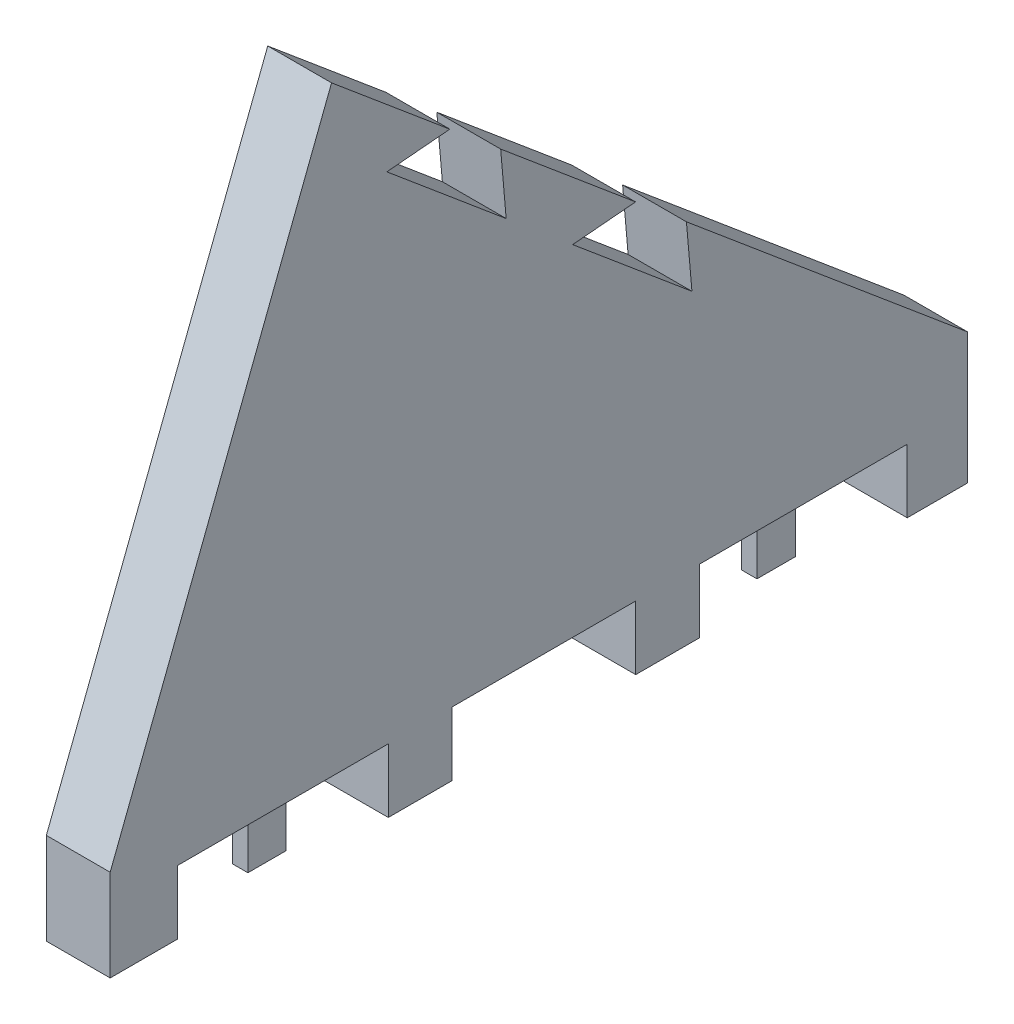
ISO-10303-21;
HEADER;
FILE_DESCRIPTION(('STEP AP214'),'2;1');
FILE_NAME('part.step','',(''),(''),'','','');
FILE_SCHEMA(('AUTOMOTIVE_DESIGN { 1 0 10303 214 1 1 1 1 }'));
ENDSEC;
DATA;
#1=APPLICATION_CONTEXT('core data for automotive mechanical design processes');
#2=APPLICATION_PROTOCOL_DEFINITION('international standard','automotive_design',2000,#1);
#3=PRODUCT_CONTEXT('',#1,'mechanical');
#4=PRODUCT('Part','Part','',(#3));
#5=PRODUCT_RELATED_PRODUCT_CATEGORY('part','',(#4));
#6=PRODUCT_DEFINITION_FORMATION('','',#4);
#7=PRODUCT_DEFINITION_CONTEXT('part definition',#1,'design');
#8=PRODUCT_DEFINITION('design','',#6,#7);
#9=PRODUCT_DEFINITION_SHAPE('','',#8);
#10=(LENGTH_UNIT() NAMED_UNIT(*) SI_UNIT(.MILLI.,.METRE.));
#11=(NAMED_UNIT(*) PLANE_ANGLE_UNIT() SI_UNIT($,.RADIAN.));
#12=(NAMED_UNIT(*) SI_UNIT($,.STERADIAN.) SOLID_ANGLE_UNIT());
#13=UNCERTAINTY_MEASURE_WITH_UNIT(LENGTH_MEASURE(1.E-05),#10,'distance_accuracy_value','');
#14=(GEOMETRIC_REPRESENTATION_CONTEXT(3) GLOBAL_UNCERTAINTY_ASSIGNED_CONTEXT((#13)) GLOBAL_UNIT_ASSIGNED_CONTEXT((#10,
#11,#12)) REPRESENTATION_CONTEXT('',''));
#15=CARTESIAN_POINT('',(0.,0.,0.));
#16=DIRECTION('',(0.,0.,1.));
#17=DIRECTION('',(1.,0.,0.));
#18=AXIS2_PLACEMENT_3D('',#15,#16,#17);
#19=CARTESIAN_POINT('',(5.,4.99883863747726,0.));
#20=DIRECTION('',(0.,1.,0.));
#21=DIRECTION('',(0.,0.,1.));
#22=AXIS2_PLACEMENT_3D('',#19,#20,#21);
#23=PLANE('',#22);
#24=DIRECTION('',(-1.,0.,0.));
#25=VECTOR('',#24,1.);
#26=CARTESIAN_POINT('',(3.25,4.99883863747764,-18.442857145));
#27=LINE('',#26,#25);
#28=CARTESIAN_POINT('',(3.25,4.99883863747751,-18.442857145));
#29=VERTEX_POINT('',#28);
#30=CARTESIAN_POINT('',(2.05,4.99883863747751,-18.442857145));
#31=VERTEX_POINT('',#30);
#32=EDGE_CURVE('E62',#29,#31,#27,.T.);
#33=ORIENTED_EDGE('',*,*,#32,.F.);
#34=DIRECTION('',(0.,0.,-1.));
#35=VECTOR('',#34,1.);
#36=CARTESIAN_POINT('',(3.25,4.99883863747764,0.));
#37=LINE('',#36,#35);
#38=CARTESIAN_POINT('',(3.25,4.99883863747755,-21.442857145));
#39=VERTEX_POINT('',#38);
#40=EDGE_CURVE('E304',#29,#39,#37,.T.);
#41=ORIENTED_EDGE('',*,*,#40,.T.);
#42=DIRECTION('',(-1.,0.,0.));
#43=VECTOR('',#42,1.);
#44=CARTESIAN_POINT('',(3.25,4.99883863747764,-21.442857145));
#45=LINE('',#44,#43);
#46=CARTESIAN_POINT('',(2.05,4.99883863747764,-21.442857145));
#47=VERTEX_POINT('',#46);
#48=EDGE_CURVE('E316',#39,#47,#45,.T.);
#49=ORIENTED_EDGE('',*,*,#48,.T.);
#50=DIRECTION('',(0.,0.,-1.));
#51=VECTOR('',#50,1.);
#52=CARTESIAN_POINT('',(2.05,4.99883863747764,0.));
#53=LINE('',#52,#51);
#54=EDGE_CURVE('E299',#31,#47,#53,.T.);
#55=ORIENTED_EDGE('',*,*,#54,.F.);
#56=EDGE_LOOP('',(#33,#41,#49,#55));
#57=FACE_BOUND('',#56,.T.);
#58=DIRECTION('',(0.,0.,-1.));
#59=VECTOR('',#58,1.);
#60=CARTESIAN_POINT('',(0.,4.99883863747726,0.));
#61=LINE('',#60,#59);
#62=CARTESIAN_POINT('',(0.,4.99883863747765,-12.192857145));
#63=VERTEX_POINT('',#62);
#64=CARTESIAN_POINT('',(0.,4.99883863747765,-28.4653269855797));
#65=VERTEX_POINT('',#64);
#66=EDGE_CURVE('E323',#63,#65,#61,.T.);
#67=ORIENTED_EDGE('',*,*,#66,.T.);
#68=DIRECTION('',(-1.,0.,0.));
#69=VECTOR('',#68,1.);
#70=CARTESIAN_POINT('',(5.,4.99883863747765,-28.4653269855797));
#71=LINE('',#70,#69);
#72=CARTESIAN_POINT('',(5.,4.99883863747765,-28.4653269855797));
#73=VERTEX_POINT('',#72);
#74=EDGE_CURVE('E11',#73,#65,#71,.T.);
#75=ORIENTED_EDGE('',*,*,#74,.F.);
#76=DIRECTION('',(0.,0.,-1.));
#77=VECTOR('',#76,1.);
#78=CARTESIAN_POINT('',(5.,4.99883863747726,0.));
#79=LINE('',#78,#77);
#80=CARTESIAN_POINT('',(5.,4.99883863747765,-12.192857145));
#81=VERTEX_POINT('',#80);
#82=EDGE_CURVE('E324',#81,#73,#79,.T.);
#83=ORIENTED_EDGE('',*,*,#82,.F.);
#84=DIRECTION('',(-1.,0.,0.));
#85=VECTOR('',#84,1.);
#86=CARTESIAN_POINT('',(5.,4.99883863747765,-12.192857145));
#87=LINE('',#86,#85);
#88=EDGE_CURVE('E387',#81,#63,#87,.T.);
#89=ORIENTED_EDGE('',*,*,#88,.T.);
#90=EDGE_LOOP('',(#67,#75,#83,#89));
#91=FACE_BOUND('',#90,.T.);
#92=ADVANCED_FACE('F40',(#57,#91),#23,.F.);
#93=CARTESIAN_POINT('',(5.,0.,-28.4653269855797));
#94=DIRECTION('',(0.,0.,-1.));
#95=DIRECTION('',(-1.,0.,0.));
#96=AXIS2_PLACEMENT_3D('',#93,#94,#95);
#97=PLANE('',#96);
#98=DIRECTION('',(0.,-1.,0.));
#99=VECTOR('',#98,1.);
#100=CARTESIAN_POINT('',(0.,0.,-28.4653269855797));
#101=LINE('',#100,#99);
#102=CARTESIAN_POINT('',(0.,0.00505467967505297,-28.4653269855797));
#103=VERTEX_POINT('',#102);
#104=EDGE_CURVE('E390',#65,#103,#101,.T.);
#105=ORIENTED_EDGE('',*,*,#104,.T.);
#106=DIRECTION('',(-1.,0.,0.));
#107=VECTOR('',#106,1.);
#108=CARTESIAN_POINT('',(5.,0.00505467967505297,-28.4653269855797));
#109=LINE('',#108,#107);
#110=CARTESIAN_POINT('',(5.,0.00505467967505297,-28.4653269855797));
#111=VERTEX_POINT('',#110);
#112=EDGE_CURVE('E47',#111,#103,#109,.T.);
#113=ORIENTED_EDGE('',*,*,#112,.F.);
#114=DIRECTION('',(0.,-1.,0.));
#115=VECTOR('',#114,1.);
#116=CARTESIAN_POINT('',(5.,0.,-28.4653269855797));
#117=LINE('',#116,#115);
#118=EDGE_CURVE('E327',#73,#111,#117,.T.);
#119=ORIENTED_EDGE('',*,*,#118,.F.);
#120=ORIENTED_EDGE('',*,*,#74,.T.);
#121=EDGE_LOOP('',(#105,#113,#119,#120));
#122=FACE_BOUND('',#121,.T.);
#123=ADVANCED_FACE('F527',(#122),#97,.F.);
#124=CARTESIAN_POINT('',(5.,0.00505467967505297,0.));
#125=DIRECTION('',(0.,1.,0.));
#126=DIRECTION('',(0.,0.,1.));
#127=AXIS2_PLACEMENT_3D('',#124,#125,#126);
#128=PLANE('',#127);
#129=DIRECTION('',(0.,0.,-1.));
#130=VECTOR('',#129,1.);
#131=CARTESIAN_POINT('',(0.,0.00505467967505297,0.));
#132=LINE('',#131,#130);
#133=CARTESIAN_POINT('',(0.,0.00505467967505297,-33.1992749222476));
#134=VERTEX_POINT('',#133);
#135=EDGE_CURVE('E392',#103,#134,#132,.T.);
#136=ORIENTED_EDGE('',*,*,#135,.T.);
#137=DIRECTION('',(-1.,0.,0.));
#138=VECTOR('',#137,1.);
#139=CARTESIAN_POINT('',(5.,0.00505467967505297,-33.1992749222476));
#140=LINE('',#139,#138);
#141=CARTESIAN_POINT('',(5.,0.00505467967505297,-33.1992749222476));
#142=VERTEX_POINT('',#141);
#143=EDGE_CURVE('E502',#142,#134,#140,.T.);
#144=ORIENTED_EDGE('',*,*,#143,.F.);
#145=DIRECTION('',(0.,0.,-1.));
#146=VECTOR('',#145,1.);
#147=CARTESIAN_POINT('',(5.,0.00505467967505297,0.));
#148=LINE('',#147,#146);
#149=EDGE_CURVE('E330',#111,#142,#148,.T.);
#150=ORIENTED_EDGE('',*,*,#149,.F.);
#151=ORIENTED_EDGE('',*,*,#112,.T.);
#152=EDGE_LOOP('',(#136,#144,#150,#151));
#153=FACE_BOUND('',#152,.T.);
#154=ADVANCED_FACE('F509',(#153),#128,.F.);
#155=CARTESIAN_POINT('',(5.,0.,-33.1992749222476));
#156=DIRECTION('',(0.,0.,1.));
#157=DIRECTION('',(0.,-1.,0.));
#158=AXIS2_PLACEMENT_3D('',#155,#156,#157);
#159=PLANE('',#158);
#160=DIRECTION('',(0.,1.,0.));
#161=VECTOR('',#160,1.);
#162=CARTESIAN_POINT('',(0.,0.,-33.1992749222476));
#163=LINE('',#162,#161);
#164=CARTESIAN_POINT('',(0.,10.2523383018279,-33.1992749222476));
#165=VERTEX_POINT('',#164);
#166=EDGE_CURVE('E394',#134,#165,#163,.T.);
#167=ORIENTED_EDGE('',*,*,#166,.T.);
#168=DIRECTION('',(-1.,0.,0.));
#169=VECTOR('',#168,1.);
#170=CARTESIAN_POINT('',(5.,10.2523383018279,-33.1992749222476));
#171=LINE('',#170,#169);
#172=CARTESIAN_POINT('',(5.,10.2523383018279,-33.1992749222476));
#173=VERTEX_POINT('',#172);
#174=EDGE_CURVE('E500',#173,#165,#171,.T.);
#175=ORIENTED_EDGE('',*,*,#174,.F.);
#176=DIRECTION('',(0.,1.,0.));
#177=VECTOR('',#176,1.);
#178=CARTESIAN_POINT('',(5.,0.,-33.1992749222476));
#179=LINE('',#178,#177);
#180=EDGE_CURVE('E332',#142,#173,#179,.T.);
#181=ORIENTED_EDGE('',*,*,#180,.F.);
#182=ORIENTED_EDGE('',*,*,#143,.T.);
#183=EDGE_LOOP('',(#167,#175,#181,#182));
#184=FACE_BOUND('',#183,.T.);
#185=ADVANCED_FACE('F520',(#184),#159,.F.);
#186=CARTESIAN_POINT('',(5.,22.3637707512892,-18.7654317891397));
#187=DIRECTION('',(0.,0.766044443118983,-0.642787609686534));
#188=DIRECTION('',(0.,0.642787609686534,0.766044443118983));
#189=AXIS2_PLACEMENT_3D('',#186,#187,#188);
#190=PLANE('',#189);
#191=DIRECTION('',(0.,-0.642787609686534,-0.766044443118983));
#192=VECTOR('',#191,1.);
#193=CARTESIAN_POINT('',(0.,22.3637707512892,-18.7654317891397));
#194=LINE('',#193,#192);
#195=CARTESIAN_POINT('',(0.,28.7402866407311,-11.1661960696631));
#196=VERTEX_POINT('',#195);
#197=EDGE_CURVE('E397',#196,#165,#194,.T.);
#198=ORIENTED_EDGE('',*,*,#197,.F.);
#199=DIRECTION('',(-1.,0.,0.));
#200=VECTOR('',#199,1.);
#201=CARTESIAN_POINT('',(5.,28.7402866407311,-11.1661960696631));
#202=LINE('',#201,#200);
#203=CARTESIAN_POINT('',(5.,28.7402866407311,-11.1661960696631));
#204=VERTEX_POINT('',#203);
#205=EDGE_CURVE('E498',#204,#196,#202,.T.);
#206=ORIENTED_EDGE('',*,*,#205,.F.);
#207=DIRECTION('',(0.,-0.642787609686534,-0.766044443118983));
#208=VECTOR('',#207,1.);
#209=CARTESIAN_POINT('',(5.,22.3637707512892,-18.7654317891397));
#210=LINE('',#209,#208);
#211=EDGE_CURVE('E334',#204,#173,#210,.T.);
#212=ORIENTED_EDGE('',*,*,#211,.T.);
#213=ORIENTED_EDGE('',*,*,#174,.T.);
#214=EDGE_LOOP('',(#198,#206,#212,#213));
#215=FACE_BOUND('',#214,.T.);
#216=ADVANCED_FACE('F614',(#215),#190,.T.);
#217=CARTESIAN_POINT('',(5.,1.18780956605756,-13.5767254657555));
#218=DIRECTION('',(0.,0.0871557427476754,-0.996194698091744));
#219=DIRECTION('',(0.,0.996194698091744,0.0871557427476754));
#220=AXIS2_PLACEMENT_3D('',#217,#218,#219);
#221=PLANE('',#220);
#222=DIRECTION('',(0.,-0.996194698091744,-0.0871557427476754));
#223=VECTOR('',#222,1.);
#224=CARTESIAN_POINT('',(0.,1.18780956605756,-13.5767254657555));
#225=LINE('',#224,#223);
#226=CARTESIAN_POINT('',(0.,23.8093744559119,-11.5975949866768));
#227=VERTEX_POINT('',#226);
#228=EDGE_CURVE('E400',#196,#227,#225,.T.);
#229=ORIENTED_EDGE('',*,*,#228,.T.);
#230=DIRECTION('',(-1.,0.,0.));
#231=VECTOR('',#230,1.);
#232=CARTESIAN_POINT('',(5.,23.8093744559119,-11.5975949866768));
#233=LINE('',#232,#231);
#234=CARTESIAN_POINT('',(5.,23.8093744559119,-11.5975949866768));
#235=VERTEX_POINT('',#234);
#236=EDGE_CURVE('E495',#235,#227,#233,.T.);
#237=ORIENTED_EDGE('',*,*,#236,.F.);
#238=DIRECTION('',(0.,-0.996194698091744,-0.0871557427476754));
#239=VECTOR('',#238,1.);
#240=CARTESIAN_POINT('',(5.,1.18780956605756,-13.5767254657555));
#241=LINE('',#240,#239);
#242=EDGE_CURVE('E337',#204,#235,#241,.T.);
#243=ORIENTED_EDGE('',*,*,#242,.F.);
#244=ORIENTED_EDGE('',*,*,#205,.T.);
#245=EDGE_LOOP('',(#229,#237,#243,#244));
#246=FACE_BOUND('',#245,.T.);
#247=ADVANCED_FACE('F616',(#246),#221,.F.);
#248=CARTESIAN_POINT('',(5.,19.6826152003728,-16.5156751552369));
#249=DIRECTION('',(0.,-0.766044443118982,0.642787609686535));
#250=DIRECTION('',(0.,-0.642787609686535,-0.766044443118982));
#251=AXIS2_PLACEMENT_3D('',#248,#249,#250);
#252=PLANE('',#251);
#253=DIRECTION('',(0.,0.642787609686535,0.766044443118982));
#254=VECTOR('',#253,1.);
#255=CARTESIAN_POINT('',(0.,19.6826152003728,-16.5156751552369));
#256=LINE('',#255,#254);
#257=CARTESIAN_POINT('',(0.,31.6513832940876,-2.25185278062518));
#258=VERTEX_POINT('',#257);
#259=EDGE_CURVE('E402',#227,#258,#256,.T.);
#260=ORIENTED_EDGE('',*,*,#259,.T.);
#261=DIRECTION('',(-1.,0.,0.));
#262=VECTOR('',#261,1.);
#263=CARTESIAN_POINT('',(5.,31.6513832940876,-2.25185278062518));
#264=LINE('',#263,#262);
#265=CARTESIAN_POINT('',(5.,31.6513832940876,-2.25185278062518));
#266=VERTEX_POINT('',#265);
#267=EDGE_CURVE('E492',#266,#258,#264,.T.);
#268=ORIENTED_EDGE('',*,*,#267,.F.);
#269=DIRECTION('',(0.,0.642787609686535,0.766044443118982));
#270=VECTOR('',#269,1.);
#271=CARTESIAN_POINT('',(5.,19.6826152003728,-16.5156751552369));
#272=LINE('',#271,#270);
#273=EDGE_CURVE('E339',#235,#266,#272,.T.);
#274=ORIENTED_EDGE('',*,*,#273,.F.);
#275=ORIENTED_EDGE('',*,*,#236,.T.);
#276=EDGE_LOOP('',(#260,#268,#274,#275));
#277=FACE_BOUND('',#276,.T.);
#278=ADVANCED_FACE('F610',(#277),#252,.F.);
#279=CARTESIAN_POINT('',(5.,31.2154404119682,2.7309971630162));
#280=DIRECTION('',(0.,0.996194698091746,0.0871557427476577));
#281=DIRECTION('',(0.,-0.0871557427476577,0.996194698091746));
#282=AXIS2_PLACEMENT_3D('',#279,#280,#281);
#283=PLANE('',#282);
#284=DIRECTION('',(0.,0.0871557427476577,-0.996194698091746));
#285=VECTOR('',#284,1.);
#286=CARTESIAN_POINT('',(0.,31.2154404119682,2.7309971630162));
#287=LINE('',#286,#285);
#288=CARTESIAN_POINT('',(0.,32.0827822111011,-7.18276496544443));
#289=VERTEX_POINT('',#288);
#290=EDGE_CURVE('E404',#258,#289,#287,.T.);
#291=ORIENTED_EDGE('',*,*,#290,.T.);
#292=DIRECTION('',(-1.,0.,0.));
#293=VECTOR('',#292,1.);
#294=CARTESIAN_POINT('',(5.,32.0827822111011,-7.18276496544443));
#295=LINE('',#294,#293);
#296=CARTESIAN_POINT('',(5.,32.0827822111011,-7.18276496544443));
#297=VERTEX_POINT('',#296);
#298=EDGE_CURVE('E490',#297,#289,#295,.T.);
#299=ORIENTED_EDGE('',*,*,#298,.F.);
#300=DIRECTION('',(0.,0.0871557427476577,-0.996194698091746));
#301=VECTOR('',#300,1.);
#302=CARTESIAN_POINT('',(5.,31.2154404119682,2.7309971630162));
#303=LINE('',#302,#301);
#304=EDGE_CURVE('E341',#266,#297,#303,.T.);
#305=ORIENTED_EDGE('',*,*,#304,.F.);
#306=ORIENTED_EDGE('',*,*,#267,.T.);
#307=EDGE_LOOP('',(#291,#299,#305,#306));
#308=FACE_BOUND('',#307,.T.);
#309=ADVANCED_FACE('F606',(#308),#283,.F.);
#310=CARTESIAN_POINT('',(5.,22.3637707512892,-18.7654317891397));
#311=DIRECTION('',(0.,0.766044443118983,-0.642787609686534));
#312=DIRECTION('',(0.,0.642787609686534,0.766044443118983));
#313=AXIS2_PLACEMENT_3D('',#310,#311,#312);
#314=PLANE('',#313);
#315=DIRECTION('',(0.,-0.642787609686534,-0.766044443118983));
#316=VECTOR('',#315,1.);
#317=CARTESIAN_POINT('',(0.,22.3637707512892,-18.7654317891397));
#318=LINE('',#317,#316);
#319=CARTESIAN_POINT('',(0.,40.9532512247753,3.38864834959753));
#320=VERTEX_POINT('',#319);
#321=EDGE_CURVE('E407',#320,#289,#318,.T.);
#322=ORIENTED_EDGE('',*,*,#321,.F.);
#323=DIRECTION('',(-1.,0.,0.));
#324=VECTOR('',#323,1.);
#325=CARTESIAN_POINT('',(5.,40.9532512247753,3.38864834959753));
#326=LINE('',#325,#324);
#327=CARTESIAN_POINT('',(5.,40.9532512247753,3.38864834959753));
#328=VERTEX_POINT('',#327);
#329=EDGE_CURVE('E488',#328,#320,#326,.T.);
#330=ORIENTED_EDGE('',*,*,#329,.F.);
#331=DIRECTION('',(0.,-0.642787609686534,-0.766044443118983));
#332=VECTOR('',#331,1.);
#333=CARTESIAN_POINT('',(5.,22.3637707512892,-18.7654317891397));
#334=LINE('',#333,#332);
#335=EDGE_CURVE('E343',#328,#297,#334,.T.);
#336=ORIENTED_EDGE('',*,*,#335,.T.);
#337=ORIENTED_EDGE('',*,*,#298,.T.);
#338=EDGE_LOOP('',(#322,#330,#336,#337));
#339=FACE_BOUND('',#338,.T.);
#340=ADVANCED_FACE('F601',(#339),#314,.T.);
#341=CARTESIAN_POINT('',(5.,0.016869648449213,-0.19282096410364));
#342=DIRECTION('',(0.,-0.0871557427476858,0.996194698091743));
#343=DIRECTION('',(0.,-0.996194698091743,-0.0871557427476858));
#344=AXIS2_PLACEMENT_3D('',#341,#342,#343);
#345=PLANE('',#344);
#346=DIRECTION('',(0.,0.996194698091743,0.0871557427476858));
#347=VECTOR('',#346,1.);
#348=CARTESIAN_POINT('',(0.,0.016869648449213,-0.19282096410364));
#349=LINE('',#348,#347);
#350=CARTESIAN_POINT('',(0.,36.0223390399561,2.95724943258386));
#351=VERTEX_POINT('',#350);
#352=EDGE_CURVE('E410',#351,#320,#349,.T.);
#353=ORIENTED_EDGE('',*,*,#352,.F.);
#354=DIRECTION('',(-1.,0.,0.));
#355=VECTOR('',#354,1.);
#356=CARTESIAN_POINT('',(5.,36.0223390399561,2.95724943258386));
#357=LINE('',#356,#355);
#358=CARTESIAN_POINT('',(5.,36.0223390399561,2.95724943258386));
#359=VERTEX_POINT('',#358);
#360=EDGE_CURVE('E486',#359,#351,#357,.T.);
#361=ORIENTED_EDGE('',*,*,#360,.F.);
#362=DIRECTION('',(0.,0.996194698091743,0.0871557427476858));
#363=VECTOR('',#362,1.);
#364=CARTESIAN_POINT('',(5.,0.016869648449213,-0.19282096410364));
#365=LINE('',#364,#363);
#366=EDGE_CURVE('E346',#359,#328,#365,.T.);
#367=ORIENTED_EDGE('',*,*,#366,.T.);
#368=ORIENTED_EDGE('',*,*,#329,.T.);
#369=EDGE_LOOP('',(#353,#361,#367,#368));
#370=FACE_BOUND('',#369,.T.);
#371=ADVANCED_FACE('F596',(#370),#345,.T.);
#372=CARTESIAN_POINT('',(5.,19.6826152003734,-16.5156751552369));
#373=DIRECTION('',(0.,0.766044443118992,-0.642787609686523));
#374=DIRECTION('',(0.,0.642787609686523,0.766044443118992));
#375=AXIS2_PLACEMENT_3D('',#372,#373,#374);
#376=PLANE('',#375);
#377=DIRECTION('',(0.,-0.642787609686523,-0.766044443118992));
#378=VECTOR('',#377,1.);
#379=CARTESIAN_POINT('',(0.,19.6826152003734,-16.5156751552369));
#380=LINE('',#379,#378);
#381=CARTESIAN_POINT('',(0.,43.8643478781316,12.3029916386356));
#382=VERTEX_POINT('',#381);
#383=EDGE_CURVE('E413',#382,#351,#380,.T.);
#384=ORIENTED_EDGE('',*,*,#383,.F.);
#385=DIRECTION('',(-1.,0.,0.));
#386=VECTOR('',#385,1.);
#387=CARTESIAN_POINT('',(5.,43.8643478781316,12.3029916386356));
#388=LINE('',#387,#386);
#389=CARTESIAN_POINT('',(5.,43.8643478781316,12.3029916386356));
#390=VERTEX_POINT('',#389);
#391=EDGE_CURVE('E484',#390,#382,#388,.T.);
#392=ORIENTED_EDGE('',*,*,#391,.F.);
#393=DIRECTION('',(0.,-0.642787609686523,-0.766044443118992));
#394=VECTOR('',#393,1.);
#395=CARTESIAN_POINT('',(5.,19.6826152003734,-16.5156751552369));
#396=LINE('',#395,#394);
#397=EDGE_CURVE('E349',#390,#359,#396,.T.);
#398=ORIENTED_EDGE('',*,*,#397,.T.);
#399=ORIENTED_EDGE('',*,*,#360,.T.);
#400=EDGE_LOOP('',(#384,#392,#398,#399));
#401=FACE_BOUND('',#400,.T.);
#402=ADVANCED_FACE('F592',(#401),#376,.T.);
#403=CARTESIAN_POINT('',(5.,44.5993449136205,3.90193708062516));
#404=DIRECTION('',(0.,-0.996194698091744,-0.0871557427476757));
#405=DIRECTION('',(0.,0.0871557427476757,-0.996194698091744));
#406=AXIS2_PLACEMENT_3D('',#403,#404,#405);
#407=PLANE('',#406);
#408=DIRECTION('',(0.,-0.0871557427476757,0.996194698091744));
#409=VECTOR('',#408,1.);
#410=CARTESIAN_POINT('',(0.,44.5993449136205,3.90193708062516));
#411=LINE('',#410,#409);
#412=CARTESIAN_POINT('',(0.,44.2957467951453,7.37207945381625));
#413=VERTEX_POINT('',#412);
#414=EDGE_CURVE('E416',#413,#382,#411,.T.);
#415=ORIENTED_EDGE('',*,*,#414,.F.);
#416=DIRECTION('',(-1.,0.,0.));
#417=VECTOR('',#416,1.);
#418=CARTESIAN_POINT('',(5.,44.2957467951453,7.37207945381625));
#419=LINE('',#418,#417);
#420=CARTESIAN_POINT('',(5.,44.2957467951453,7.37207945381625));
#421=VERTEX_POINT('',#420);
#422=EDGE_CURVE('E482',#421,#413,#419,.T.);
#423=ORIENTED_EDGE('',*,*,#422,.F.);
#424=DIRECTION('',(0.,-0.0871557427476757,0.996194698091744));
#425=VECTOR('',#424,1.);
#426=CARTESIAN_POINT('',(5.,44.5993449136205,3.90193708062516));
#427=LINE('',#426,#425);
#428=EDGE_CURVE('E352',#421,#390,#427,.T.);
#429=ORIENTED_EDGE('',*,*,#428,.T.);
#430=ORIENTED_EDGE('',*,*,#391,.T.);
#431=EDGE_LOOP('',(#415,#423,#429,#430));
#432=FACE_BOUND('',#431,.T.);
#433=ADVANCED_FACE('F588',(#432),#407,.T.);
#434=CARTESIAN_POINT('',(5.,22.3637707512892,-18.7654317891397));
#435=DIRECTION('',(0.,0.766044443118983,-0.642787609686534));
#436=DIRECTION('',(0.,0.642787609686534,0.766044443118983));
#437=AXIS2_PLACEMENT_3D('',#434,#435,#436);
#438=PLANE('',#437);
#439=DIRECTION('',(0.,-0.642787609686534,-0.766044443118983));
#440=VECTOR('',#439,1.);
#441=CARTESIAN_POINT('',(0.,22.3637707512892,-18.7654317891397));
#442=LINE('',#441,#440);
#443=CARTESIAN_POINT('',(0.,52.0711838150504,16.6384844562784));
#444=VERTEX_POINT('',#443);
#445=EDGE_CURVE('E419',#444,#413,#442,.T.);
#446=ORIENTED_EDGE('',*,*,#445,.F.);
#447=DIRECTION('',(-1.,0.,0.));
#448=VECTOR('',#447,1.);
#449=CARTESIAN_POINT('',(5.,52.0711838150504,16.6384844562784));
#450=LINE('',#449,#448);
#451=CARTESIAN_POINT('',(5.,52.0711838150504,16.6384844562784));
#452=VERTEX_POINT('',#451);
#453=EDGE_CURVE('E480',#452,#444,#450,.T.);
#454=ORIENTED_EDGE('',*,*,#453,.F.);
#455=DIRECTION('',(0.,-0.642787609686534,-0.766044443118983));
#456=VECTOR('',#455,1.);
#457=CARTESIAN_POINT('',(5.,22.3637707512892,-18.7654317891397));
#458=LINE('',#457,#456);
#459=EDGE_CURVE('E355',#452,#421,#458,.T.);
#460=ORIENTED_EDGE('',*,*,#459,.T.);
#461=ORIENTED_EDGE('',*,*,#422,.T.);
#462=EDGE_LOOP('',(#446,#454,#460,#461));
#463=FACE_BOUND('',#462,.T.);
#464=ADVANCED_FACE('F584',(#463),#438,.T.);
#465=CARTESIAN_POINT('',(5.,12.358442577524,31.983506920508));
#466=DIRECTION('',(0.,0.360429186226386,0.932786578867956));
#467=DIRECTION('',(0.,-0.932786578867956,0.360429186226386));
#468=AXIS2_PLACEMENT_3D('',#465,#466,#467);
#469=PLANE('',#468);
#470=DIRECTION('',(0.,0.932786578867956,-0.360429186226386));
#471=VECTOR('',#470,1.);
#472=CARTESIAN_POINT('',(0.,12.358442577524,31.983506920508));
#473=LINE('',#472,#471);
#474=CARTESIAN_POINT('',(0.,7.18217750491239,33.9836182536681));
#475=VERTEX_POINT('',#474);
#476=EDGE_CURVE('E422',#475,#444,#473,.T.);
#477=ORIENTED_EDGE('',*,*,#476,.F.);
#478=DIRECTION('',(-1.,0.,0.));
#479=VECTOR('',#478,1.);
#480=CARTESIAN_POINT('',(5.,7.18217750491239,33.9836182536681));
#481=LINE('',#480,#479);
#482=CARTESIAN_POINT('',(5.,7.18217750491239,33.9836182536681));
#483=VERTEX_POINT('',#482);
#484=EDGE_CURVE('E478',#483,#475,#481,.T.);
#485=ORIENTED_EDGE('',*,*,#484,.F.);
#486=DIRECTION('',(0.,0.932786578867956,-0.360429186226386));
#487=VECTOR('',#486,1.);
#488=CARTESIAN_POINT('',(5.,12.358442577524,31.983506920508));
#489=LINE('',#488,#487);
#490=EDGE_CURVE('E358',#483,#452,#489,.T.);
#491=ORIENTED_EDGE('',*,*,#490,.T.);
#492=ORIENTED_EDGE('',*,*,#453,.T.);
#493=EDGE_LOOP('',(#477,#485,#491,#492));
#494=FACE_BOUND('',#493,.T.);
#495=ADVANCED_FACE('F580',(#494),#469,.T.);
#496=CARTESIAN_POINT('',(5.,0.,33.9836182536681));
#497=DIRECTION('',(0.,0.,-1.));
#498=DIRECTION('',(-1.,0.,0.));
#499=AXIS2_PLACEMENT_3D('',#496,#497,#498);
#500=PLANE('',#499);
#501=DIRECTION('',(0.,-1.,0.));
#502=VECTOR('',#501,1.);
#503=CARTESIAN_POINT('',(0.,0.,33.9836182536681));
#504=LINE('',#503,#502);
#505=CARTESIAN_POINT('',(0.,0.00505467967505297,33.9836182536681));
#506=VERTEX_POINT('',#505);
#507=EDGE_CURVE('E425',#475,#506,#504,.T.);
#508=ORIENTED_EDGE('',*,*,#507,.T.);
#509=DIRECTION('',(-1.,0.,0.));
#510=VECTOR('',#509,1.);
#511=CARTESIAN_POINT('',(5.,0.00505467967505297,33.9836182536681));
#512=LINE('',#511,#510);
#513=CARTESIAN_POINT('',(5.,0.00505467967505297,33.9836182536681));
#514=VERTEX_POINT('',#513);
#515=EDGE_CURVE('E475',#514,#506,#512,.T.);
#516=ORIENTED_EDGE('',*,*,#515,.F.);
#517=DIRECTION('',(0.,-1.,0.));
#518=VECTOR('',#517,1.);
#519=CARTESIAN_POINT('',(5.,0.,33.9836182536681));
#520=LINE('',#519,#518);
#521=EDGE_CURVE('E361',#483,#514,#520,.T.);
#522=ORIENTED_EDGE('',*,*,#521,.F.);
#523=ORIENTED_EDGE('',*,*,#484,.T.);
#524=EDGE_LOOP('',(#508,#516,#522,#523));
#525=FACE_BOUND('',#524,.T.);
#526=ADVANCED_FACE('F576',(#525),#500,.F.);
#527=CARTESIAN_POINT('',(5.,0.00505467967505297,0.));
#528=DIRECTION('',(0.,1.,0.));
#529=DIRECTION('',(0.,0.,1.));
#530=AXIS2_PLACEMENT_3D('',#527,#528,#529);
#531=PLANE('',#530);
#532=DIRECTION('',(0.,0.,-1.));
#533=VECTOR('',#532,1.);
#534=CARTESIAN_POINT('',(0.,0.00505467967505297,0.));
#535=LINE('',#534,#533);
#536=CARTESIAN_POINT('',(0.,0.00505467967505335,28.6919277339166));
#537=VERTEX_POINT('',#536);
#538=EDGE_CURVE('E427',#506,#537,#535,.T.);
#539=ORIENTED_EDGE('',*,*,#538,.T.);
#540=DIRECTION('',(-1.,0.,0.));
#541=VECTOR('',#540,1.);
#542=CARTESIAN_POINT('',(5.,0.00505467967505335,28.6919277339166));
#543=LINE('',#542,#541);
#544=CARTESIAN_POINT('',(5.,0.00505467967505335,28.6919277339166));
#545=VERTEX_POINT('',#544);
#546=EDGE_CURVE('E473',#545,#537,#543,.T.);
#547=ORIENTED_EDGE('',*,*,#546,.F.);
#548=DIRECTION('',(0.,0.,-1.));
#549=VECTOR('',#548,1.);
#550=CARTESIAN_POINT('',(5.,0.00505467967505297,0.));
#551=LINE('',#550,#549);
#552=EDGE_CURVE('E363',#514,#545,#551,.T.);
#553=ORIENTED_EDGE('',*,*,#552,.F.);
#554=ORIENTED_EDGE('',*,*,#515,.T.);
#555=EDGE_LOOP('',(#539,#547,#553,#554));
#556=FACE_BOUND('',#555,.T.);
#557=ADVANCED_FACE('F572',(#556),#531,.F.);
#558=CARTESIAN_POINT('',(5.,0.,28.6919277339166));
#559=DIRECTION('',(0.,0.,-1.));
#560=DIRECTION('',(-1.,0.,0.));
#561=AXIS2_PLACEMENT_3D('',#558,#559,#560);
#562=PLANE('',#561);
#563=DIRECTION('',(0.,-1.,0.));
#564=VECTOR('',#563,1.);
#565=CARTESIAN_POINT('',(0.,0.,28.6919277339166));
#566=LINE('',#565,#564);
#567=CARTESIAN_POINT('',(0.,4.99883863747764,28.6919277339166));
#568=VERTEX_POINT('',#567);
#569=EDGE_CURVE('E430',#568,#537,#566,.T.);
#570=ORIENTED_EDGE('',*,*,#569,.F.);
#571=DIRECTION('',(-1.,0.,0.));
#572=VECTOR('',#571,1.);
#573=CARTESIAN_POINT('',(5.,4.99883863747764,28.6919277339166));
#574=LINE('',#573,#572);
#575=CARTESIAN_POINT('',(5.,4.99883863747764,28.6919277339166));
#576=VERTEX_POINT('',#575);
#577=EDGE_CURVE('E471',#576,#568,#574,.T.);
#578=ORIENTED_EDGE('',*,*,#577,.F.);
#579=DIRECTION('',(0.,-1.,0.));
#580=VECTOR('',#579,1.);
#581=CARTESIAN_POINT('',(5.,0.,28.6919277339166));
#582=LINE('',#581,#580);
#583=EDGE_CURVE('E365',#576,#545,#582,.T.);
#584=ORIENTED_EDGE('',*,*,#583,.T.);
#585=ORIENTED_EDGE('',*,*,#546,.T.);
#586=EDGE_LOOP('',(#570,#578,#584,#585));
#587=FACE_BOUND('',#586,.T.);
#588=ADVANCED_FACE('F567',(#587),#562,.T.);
#589=CARTESIAN_POINT('',(5.,4.99883863747764,0.));
#590=DIRECTION('',(0.,-1.,0.));
#591=DIRECTION('',(0.,0.,-1.));
#592=AXIS2_PLACEMENT_3D('',#589,#590,#591);
#593=PLANE('',#592);
#594=DIRECTION('',(0.,0.,1.));
#595=VECTOR('',#594,1.);
#596=CARTESIAN_POINT('',(3.25,4.99883863747764,0.));
#597=LINE('',#596,#595);
#598=CARTESIAN_POINT('',(3.25,4.99883863747764,18.442857145));
#599=VERTEX_POINT('',#598);
#600=CARTESIAN_POINT('',(3.25,4.99883863747764,21.442857145));
#601=VERTEX_POINT('',#600);
#602=EDGE_CURVE('E260',#599,#601,#597,.T.);
#603=ORIENTED_EDGE('',*,*,#602,.F.);
#604=DIRECTION('',(-1.,0.,0.));
#605=VECTOR('',#604,1.);
#606=CARTESIAN_POINT('',(3.25,4.99883863747764,18.442857145));
#607=LINE('',#606,#605);
#608=CARTESIAN_POINT('',(2.05,4.99883863747764,18.442857145));
#609=VERTEX_POINT('',#608);
#610=EDGE_CURVE('E269',#599,#609,#607,.T.);
#611=ORIENTED_EDGE('',*,*,#610,.T.);
#612=DIRECTION('',(0.,0.,1.));
#613=VECTOR('',#612,1.);
#614=CARTESIAN_POINT('',(2.05,4.99883863747764,0.));
#615=LINE('',#614,#613);
#616=CARTESIAN_POINT('',(2.05,4.99883863747764,21.442857145));
#617=VERTEX_POINT('',#616);
#618=EDGE_CURVE('E288',#609,#617,#615,.T.);
#619=ORIENTED_EDGE('',*,*,#618,.T.);
#620=DIRECTION('',(-1.,0.,0.));
#621=VECTOR('',#620,1.);
#622=CARTESIAN_POINT('',(3.25,4.99883863747764,21.442857145));
#623=LINE('',#622,#621);
#624=EDGE_CURVE('E276',#601,#617,#623,.T.);
#625=ORIENTED_EDGE('',*,*,#624,.F.);
#626=EDGE_LOOP('',(#603,#611,#619,#625));
#627=FACE_BOUND('',#626,.T.);
#628=DIRECTION('',(0.,0.,1.));
#629=VECTOR('',#628,1.);
#630=CARTESIAN_POINT('',(0.,4.99883863747764,0.));
#631=LINE('',#630,#629);
#632=CARTESIAN_POINT('',(0.,4.99883863747764,12.192857145));
#633=VERTEX_POINT('',#632);
#634=EDGE_CURVE('E433',#633,#568,#631,.T.);
#635=ORIENTED_EDGE('',*,*,#634,.F.);
#636=DIRECTION('',(-1.,0.,0.));
#637=VECTOR('',#636,1.);
#638=CARTESIAN_POINT('',(5.,4.99883863747764,12.192857145));
#639=LINE('',#638,#637);
#640=CARTESIAN_POINT('',(5.,4.99883863747764,12.192857145));
#641=VERTEX_POINT('',#640);
#642=EDGE_CURVE('E469',#641,#633,#639,.T.);
#643=ORIENTED_EDGE('',*,*,#642,.F.);
#644=DIRECTION('',(0.,0.,1.));
#645=VECTOR('',#644,1.);
#646=CARTESIAN_POINT('',(5.,4.99883863747764,0.));
#647=LINE('',#646,#645);
#648=EDGE_CURVE('E368',#641,#576,#647,.T.);
#649=ORIENTED_EDGE('',*,*,#648,.T.);
#650=ORIENTED_EDGE('',*,*,#577,.T.);
#651=EDGE_LOOP('',(#635,#643,#649,#650));
#652=FACE_BOUND('',#651,.T.);
#653=ADVANCED_FACE('F279',(#627,#652),#593,.T.);
#654=CARTESIAN_POINT('',(5.,0.,12.192857145));
#655=DIRECTION('',(0.,0.,1.));
#656=DIRECTION('',(1.,0.,0.));
#657=AXIS2_PLACEMENT_3D('',#654,#655,#656);
#658=PLANE('',#657);
#659=DIRECTION('',(0.,1.,0.));
#660=VECTOR('',#659,1.);
#661=CARTESIAN_POINT('',(0.,0.,12.192857145));
#662=LINE('',#661,#660);
#663=CARTESIAN_POINT('',(0.,4.16328420696499E-06,12.192857145));
#664=VERTEX_POINT('',#663);
#665=EDGE_CURVE('E436',#664,#633,#662,.T.);
#666=ORIENTED_EDGE('',*,*,#665,.F.);
#667=DIRECTION('',(-1.,0.,0.));
#668=VECTOR('',#667,1.);
#669=CARTESIAN_POINT('',(5.,4.16328420696499E-06,12.192857145));
#670=LINE('',#669,#668);
#671=CARTESIAN_POINT('',(5.,4.16328420696499E-06,12.192857145));
#672=VERTEX_POINT('',#671);
#673=EDGE_CURVE('E467',#672,#664,#670,.T.);
#674=ORIENTED_EDGE('',*,*,#673,.F.);
#675=DIRECTION('',(0.,1.,0.));
#676=VECTOR('',#675,1.);
#677=CARTESIAN_POINT('',(5.,0.,12.192857145));
#678=LINE('',#677,#676);
#679=EDGE_CURVE('E371',#672,#641,#678,.T.);
#680=ORIENTED_EDGE('',*,*,#679,.T.);
#681=ORIENTED_EDGE('',*,*,#642,.T.);
#682=EDGE_LOOP('',(#666,#674,#680,#681));
#683=FACE_BOUND('',#682,.T.);
#684=ADVANCED_FACE('F560',(#683),#658,.T.);
#685=CARTESIAN_POINT('',(5.,4.16328420696499E-06,0.));
#686=DIRECTION('',(0.,1.,0.));
#687=DIRECTION('',(0.,0.,1.));
#688=AXIS2_PLACEMENT_3D('',#685,#686,#687);
#689=PLANE('',#688);
#690=DIRECTION('',(0.,0.,-1.));
#691=VECTOR('',#690,1.);
#692=CARTESIAN_POINT('',(0.,4.16328420696499E-06,0.));
#693=LINE('',#692,#691);
#694=CARTESIAN_POINT('',(0.,4.16328420696499E-06,7.192857145));
#695=VERTEX_POINT('',#694);
#696=EDGE_CURVE('E439',#664,#695,#693,.T.);
#697=ORIENTED_EDGE('',*,*,#696,.T.);
#698=DIRECTION('',(-1.,0.,0.));
#699=VECTOR('',#698,1.);
#700=CARTESIAN_POINT('',(5.,4.16328420696499E-06,7.192857145));
#701=LINE('',#700,#699);
#702=CARTESIAN_POINT('',(5.,4.16328420696499E-06,7.192857145));
#703=VERTEX_POINT('',#702);
#704=EDGE_CURVE('E464',#703,#695,#701,.T.);
#705=ORIENTED_EDGE('',*,*,#704,.F.);
#706=DIRECTION('',(0.,0.,-1.));
#707=VECTOR('',#706,1.);
#708=CARTESIAN_POINT('',(5.,4.16328420696499E-06,0.));
#709=LINE('',#708,#707);
#710=EDGE_CURVE('E374',#672,#703,#709,.T.);
#711=ORIENTED_EDGE('',*,*,#710,.F.);
#712=ORIENTED_EDGE('',*,*,#673,.T.);
#713=EDGE_LOOP('',(#697,#705,#711,#712));
#714=FACE_BOUND('',#713,.T.);
#715=ADVANCED_FACE('F556',(#714),#689,.F.);
#716=CARTESIAN_POINT('',(5.,0.,7.192857145));
#717=DIRECTION('',(0.,0.,1.));
#718=DIRECTION('',(1.,0.,0.));
#719=AXIS2_PLACEMENT_3D('',#716,#717,#718);
#720=PLANE('',#719);
#721=DIRECTION('',(0.,1.,0.));
#722=VECTOR('',#721,1.);
#723=CARTESIAN_POINT('',(0.,0.,7.192857145));
#724=LINE('',#723,#722);
#725=CARTESIAN_POINT('',(0.,5.00000416328421,7.192857145));
#726=VERTEX_POINT('',#725);
#727=EDGE_CURVE('E441',#695,#726,#724,.T.);
#728=ORIENTED_EDGE('',*,*,#727,.T.);
#729=DIRECTION('',(-1.,0.,0.));
#730=VECTOR('',#729,1.);
#731=CARTESIAN_POINT('',(5.,5.00000416328421,7.192857145));
#732=LINE('',#731,#730);
#733=CARTESIAN_POINT('',(5.,5.00000416328421,7.192857145));
#734=VERTEX_POINT('',#733);
#735=EDGE_CURVE('E461',#734,#726,#732,.T.);
#736=ORIENTED_EDGE('',*,*,#735,.F.);
#737=DIRECTION('',(0.,1.,0.));
#738=VECTOR('',#737,1.);
#739=CARTESIAN_POINT('',(5.,0.,7.192857145));
#740=LINE('',#739,#738);
#741=EDGE_CURVE('E376',#703,#734,#740,.T.);
#742=ORIENTED_EDGE('',*,*,#741,.F.);
#743=ORIENTED_EDGE('',*,*,#704,.T.);
#744=EDGE_LOOP('',(#728,#736,#742,#743));
#745=FACE_BOUND('',#744,.T.);
#746=ADVANCED_FACE('F552',(#745),#720,.F.);
#747=CARTESIAN_POINT('',(5.,5.00000416328421,0.));
#748=DIRECTION('',(0.,1.,0.));
#749=DIRECTION('',(0.,0.,1.));
#750=AXIS2_PLACEMENT_3D('',#747,#748,#749);
#751=PLANE('',#750);
#752=DIRECTION('',(0.,0.,-1.));
#753=VECTOR('',#752,1.);
#754=CARTESIAN_POINT('',(0.,5.00000416328421,0.));
#755=LINE('',#754,#753);
#756=CARTESIAN_POINT('',(0.,5.00000416328421,-7.192857145));
#757=VERTEX_POINT('',#756);
#758=EDGE_CURVE('E443',#726,#757,#755,.T.);
#759=ORIENTED_EDGE('',*,*,#758,.T.);
#760=DIRECTION('',(-1.,0.,0.));
#761=VECTOR('',#760,1.);
#762=CARTESIAN_POINT('',(5.,5.00000416328421,-7.192857145));
#763=LINE('',#762,#761);
#764=CARTESIAN_POINT('',(5.,5.00000416328421,-7.192857145));
#765=VERTEX_POINT('',#764);
#766=EDGE_CURVE('E458',#765,#757,#763,.T.);
#767=ORIENTED_EDGE('',*,*,#766,.F.);
#768=DIRECTION('',(0.,0.,-1.));
#769=VECTOR('',#768,1.);
#770=CARTESIAN_POINT('',(5.,5.00000416328421,0.));
#771=LINE('',#770,#769);
#772=EDGE_CURVE('E378',#734,#765,#771,.T.);
#773=ORIENTED_EDGE('',*,*,#772,.F.);
#774=ORIENTED_EDGE('',*,*,#735,.T.);
#775=EDGE_LOOP('',(#759,#767,#773,#774));
#776=FACE_BOUND('',#775,.T.);
#777=ADVANCED_FACE('F547',(#776),#751,.F.);
#778=CARTESIAN_POINT('',(5.,0.,-7.192857145));
#779=DIRECTION('',(0.,0.,-1.));
#780=DIRECTION('',(0.,1.,0.));
#781=AXIS2_PLACEMENT_3D('',#778,#779,#780);
#782=PLANE('',#781);
#783=DIRECTION('',(0.,-1.,0.));
#784=VECTOR('',#783,1.);
#785=CARTESIAN_POINT('',(0.,0.,-7.192857145));
#786=LINE('',#785,#784);
#787=CARTESIAN_POINT('',(0.,5.10201806187171E-06,-7.192857145));
#788=VERTEX_POINT('',#787);
#789=EDGE_CURVE('E445',#757,#788,#786,.T.);
#790=ORIENTED_EDGE('',*,*,#789,.T.);
#791=DIRECTION('',(-1.,0.,0.));
#792=VECTOR('',#791,1.);
#793=CARTESIAN_POINT('',(5.,5.10201806187171E-06,-7.192857145));
#794=LINE('',#793,#792);
#795=CARTESIAN_POINT('',(5.,5.10201806187171E-06,-7.192857145));
#796=VERTEX_POINT('',#795);
#797=EDGE_CURVE('E456',#796,#788,#794,.T.);
#798=ORIENTED_EDGE('',*,*,#797,.F.);
#799=DIRECTION('',(0.,-1.,0.));
#800=VECTOR('',#799,1.);
#801=CARTESIAN_POINT('',(5.,0.,-7.192857145));
#802=LINE('',#801,#800);
#803=EDGE_CURVE('E380',#765,#796,#802,.T.);
#804=ORIENTED_EDGE('',*,*,#803,.F.);
#805=ORIENTED_EDGE('',*,*,#766,.T.);
#806=EDGE_LOOP('',(#790,#798,#804,#805));
#807=FACE_BOUND('',#806,.T.);
#808=ADVANCED_FACE('F541',(#807),#782,.F.);
#809=CARTESIAN_POINT('',(5.,5.10201806099084E-06,0.));
#810=DIRECTION('',(0.,-1.,0.));
#811=DIRECTION('',(0.,0.,-1.));
#812=AXIS2_PLACEMENT_3D('',#809,#810,#811);
#813=PLANE('',#812);
#814=DIRECTION('',(0.,0.,1.));
#815=VECTOR('',#814,1.);
#816=CARTESIAN_POINT('',(0.,5.10201806099084E-06,0.));
#817=LINE('',#816,#815);
#818=CARTESIAN_POINT('',(0.,5.10201806248403E-06,-12.192857145));
#819=VERTEX_POINT('',#818);
#820=EDGE_CURVE('E448',#819,#788,#817,.T.);
#821=ORIENTED_EDGE('',*,*,#820,.F.);
#822=DIRECTION('',(-1.,0.,0.));
#823=VECTOR('',#822,1.);
#824=CARTESIAN_POINT('',(5.,5.10201806248403E-06,-12.192857145));
#825=LINE('',#824,#823);
#826=CARTESIAN_POINT('',(5.,5.10201806248403E-06,-12.192857145));
#827=VERTEX_POINT('',#826);
#828=EDGE_CURVE('E454',#827,#819,#825,.T.);
#829=ORIENTED_EDGE('',*,*,#828,.F.);
#830=DIRECTION('',(0.,0.,1.));
#831=VECTOR('',#830,1.);
#832=CARTESIAN_POINT('',(5.,5.10201806099084E-06,0.));
#833=LINE('',#832,#831);
#834=EDGE_CURVE('E382',#827,#796,#833,.T.);
#835=ORIENTED_EDGE('',*,*,#834,.T.);
#836=ORIENTED_EDGE('',*,*,#797,.T.);
#837=EDGE_LOOP('',(#821,#829,#835,#836));
#838=FACE_BOUND('',#837,.T.);
#839=ADVANCED_FACE('F535',(#838),#813,.T.);
#840=CARTESIAN_POINT('',(5.,0.,-12.192857145));
#841=DIRECTION('',(0.,0.,1.));
#842=DIRECTION('',(1.,0.,0.));
#843=AXIS2_PLACEMENT_3D('',#840,#841,#842);
#844=PLANE('',#843);
#845=DIRECTION('',(0.,1.,0.));
#846=VECTOR('',#845,1.);
#847=CARTESIAN_POINT('',(0.,0.,-12.192857145));
#848=LINE('',#847,#846);
#849=EDGE_CURVE('E328',#819,#63,#848,.T.);
#850=ORIENTED_EDGE('',*,*,#849,.T.);
#851=ORIENTED_EDGE('',*,*,#88,.F.);
#852=DIRECTION('',(0.,1.,0.));
#853=VECTOR('',#852,1.);
#854=CARTESIAN_POINT('',(5.,0.,-12.192857145));
#855=LINE('',#854,#853);
#856=EDGE_CURVE('E385',#827,#81,#855,.T.);
#857=ORIENTED_EDGE('',*,*,#856,.F.);
#858=ORIENTED_EDGE('',*,*,#828,.T.);
#859=EDGE_LOOP('',(#850,#851,#857,#858));
#860=FACE_BOUND('',#859,.T.);
#861=ADVANCED_FACE('F617',(#860),#844,.F.);
#862=CARTESIAN_POINT('',(5.,0.,0.));
#863=DIRECTION('',(1.,0.,0.));
#864=DIRECTION('',(0.,0.,-1.));
#865=AXIS2_PLACEMENT_3D('',#862,#863,#864);
#866=PLANE('',#865);
#867=ORIENTED_EDGE('',*,*,#82,.T.);
#868=ORIENTED_EDGE('',*,*,#118,.T.);
#869=ORIENTED_EDGE('',*,*,#149,.T.);
#870=ORIENTED_EDGE('',*,*,#180,.T.);
#871=ORIENTED_EDGE('',*,*,#211,.F.);
#872=ORIENTED_EDGE('',*,*,#242,.T.);
#873=ORIENTED_EDGE('',*,*,#273,.T.);
#874=ORIENTED_EDGE('',*,*,#304,.T.);
#875=ORIENTED_EDGE('',*,*,#335,.F.);
#876=ORIENTED_EDGE('',*,*,#366,.F.);
#877=ORIENTED_EDGE('',*,*,#397,.F.);
#878=ORIENTED_EDGE('',*,*,#428,.F.);
#879=ORIENTED_EDGE('',*,*,#459,.F.);
#880=ORIENTED_EDGE('',*,*,#490,.F.);
#881=ORIENTED_EDGE('',*,*,#521,.T.);
#882=ORIENTED_EDGE('',*,*,#552,.T.);
#883=ORIENTED_EDGE('',*,*,#583,.F.);
#884=ORIENTED_EDGE('',*,*,#648,.F.);
#885=ORIENTED_EDGE('',*,*,#679,.F.);
#886=ORIENTED_EDGE('',*,*,#710,.T.);
#887=ORIENTED_EDGE('',*,*,#741,.T.);
#888=ORIENTED_EDGE('',*,*,#772,.T.);
#889=ORIENTED_EDGE('',*,*,#803,.T.);
#890=ORIENTED_EDGE('',*,*,#834,.F.);
#891=ORIENTED_EDGE('',*,*,#856,.T.);
#892=EDGE_LOOP('',(#867,#868,#869,#870,#871,#872,#873,#874,#875,#876,#877,#878,#879,#880,#881,
#882,#883,#884,#885,#886,#887,#888,#889,#890,#891));
#893=FACE_BOUND('',#892,.T.);
#894=ADVANCED_FACE('F524',(#893),#866,.T.);
#895=CARTESIAN_POINT('',(0.,0.,0.));
#896=DIRECTION('',(1.,0.,0.));
#897=DIRECTION('',(0.,0.,-1.));
#898=AXIS2_PLACEMENT_3D('',#895,#896,#897);
#899=PLANE('',#898);
#900=ORIENTED_EDGE('',*,*,#66,.F.);
#901=ORIENTED_EDGE('',*,*,#849,.F.);
#902=ORIENTED_EDGE('',*,*,#820,.T.);
#903=ORIENTED_EDGE('',*,*,#789,.F.);
#904=ORIENTED_EDGE('',*,*,#758,.F.);
#905=ORIENTED_EDGE('',*,*,#727,.F.);
#906=ORIENTED_EDGE('',*,*,#696,.F.);
#907=ORIENTED_EDGE('',*,*,#665,.T.);
#908=ORIENTED_EDGE('',*,*,#634,.T.);
#909=ORIENTED_EDGE('',*,*,#569,.T.);
#910=ORIENTED_EDGE('',*,*,#538,.F.);
#911=ORIENTED_EDGE('',*,*,#507,.F.);
#912=ORIENTED_EDGE('',*,*,#476,.T.);
#913=ORIENTED_EDGE('',*,*,#445,.T.);
#914=ORIENTED_EDGE('',*,*,#414,.T.);
#915=ORIENTED_EDGE('',*,*,#383,.T.);
#916=ORIENTED_EDGE('',*,*,#352,.T.);
#917=ORIENTED_EDGE('',*,*,#321,.T.);
#918=ORIENTED_EDGE('',*,*,#290,.F.);
#919=ORIENTED_EDGE('',*,*,#259,.F.);
#920=ORIENTED_EDGE('',*,*,#228,.F.);
#921=ORIENTED_EDGE('',*,*,#197,.T.);
#922=ORIENTED_EDGE('',*,*,#166,.F.);
#923=ORIENTED_EDGE('',*,*,#135,.F.);
#924=ORIENTED_EDGE('',*,*,#104,.F.);
#925=EDGE_LOOP('',(#900,#901,#902,#903,#904,#905,#906,#907,#908,#909,#910,#911,#912,#913,#914,
#915,#916,#917,#918,#919,#920,#921,#922,#923,#924));
#926=FACE_BOUND('',#925,.T.);
#927=ADVANCED_FACE('F515',(#926),#899,.F.);
#928=CARTESIAN_POINT('',(3.25,0.,-18.442857145));
#929=DIRECTION('',(0.,0.,1.));
#930=DIRECTION('',(1.,0.,0.));
#931=AXIS2_PLACEMENT_3D('',#928,#929,#930);
#932=PLANE('',#931);
#933=DIRECTION('',(0.,1.,0.));
#934=VECTOR('',#933,1.);
#935=CARTESIAN_POINT('',(2.05,0.,-18.442857145));
#936=LINE('',#935,#934);
#937=CARTESIAN_POINT('',(2.05,-0.00116136252235704,-18.442857145));
#938=VERTEX_POINT('',#937);
#939=EDGE_CURVE('E275',#938,#31,#936,.T.);
#940=ORIENTED_EDGE('',*,*,#939,.F.);
#941=DIRECTION('',(-1.,0.,0.));
#942=VECTOR('',#941,1.);
#943=CARTESIAN_POINT('',(3.25,-0.00116136252235704,-18.442857145));
#944=LINE('',#943,#942);
#945=CARTESIAN_POINT('',(3.25,-0.00116136252235704,-18.442857145));
#946=VERTEX_POINT('',#945);
#947=EDGE_CURVE('E321',#946,#938,#944,.T.);
#948=ORIENTED_EDGE('',*,*,#947,.F.);
#949=DIRECTION('',(0.,1.,0.));
#950=VECTOR('',#949,1.);
#951=CARTESIAN_POINT('',(3.25,0.,-18.442857145));
#952=LINE('',#951,#950);
#953=EDGE_CURVE('E296',#946,#29,#952,.T.);
#954=ORIENTED_EDGE('',*,*,#953,.T.);
#955=ORIENTED_EDGE('',*,*,#32,.T.);
#956=EDGE_LOOP('',(#940,#948,#954,#955));
#957=FACE_BOUND('',#956,.T.);
#958=ADVANCED_FACE('F703',(#957),#932,.T.);
#959=CARTESIAN_POINT('',(3.25,-0.00116136252235478,0.));
#960=DIRECTION('',(0.,1.,0.));
#961=DIRECTION('',(0.,0.,1.));
#962=AXIS2_PLACEMENT_3D('',#959,#960,#961);
#963=PLANE('',#962);
#964=DIRECTION('',(0.,0.,-1.));
#965=VECTOR('',#964,1.);
#966=CARTESIAN_POINT('',(2.05,-0.00116136252235478,0.));
#967=LINE('',#966,#965);
#968=CARTESIAN_POINT('',(2.05,-0.00116136252235741,-21.442857145));
#969=VERTEX_POINT('',#968);
#970=EDGE_CURVE('E308',#938,#969,#967,.T.);
#971=ORIENTED_EDGE('',*,*,#970,.T.);
#972=DIRECTION('',(-1.,0.,0.));
#973=VECTOR('',#972,1.);
#974=CARTESIAN_POINT('',(3.25,-0.00116136252235741,-21.442857145));
#975=LINE('',#974,#973);
#976=CARTESIAN_POINT('',(3.25,-0.00116136252235741,-21.442857145));
#977=VERTEX_POINT('',#976);
#978=EDGE_CURVE('E318',#977,#969,#975,.T.);
#979=ORIENTED_EDGE('',*,*,#978,.F.);
#980=DIRECTION('',(0.,0.,-1.));
#981=VECTOR('',#980,1.);
#982=CARTESIAN_POINT('',(3.25,-0.00116136252235478,0.));
#983=LINE('',#982,#981);
#984=EDGE_CURVE('E298',#946,#977,#983,.T.);
#985=ORIENTED_EDGE('',*,*,#984,.F.);
#986=ORIENTED_EDGE('',*,*,#947,.T.);
#987=EDGE_LOOP('',(#971,#979,#985,#986));
#988=FACE_BOUND('',#987,.T.);
#989=ADVANCED_FACE('F726',(#988),#963,.F.);
#990=CARTESIAN_POINT('',(3.25,0.,-21.442857145));
#991=DIRECTION('',(0.,0.,1.));
#992=DIRECTION('',(1.,0.,0.));
#993=AXIS2_PLACEMENT_3D('',#990,#991,#992);
#994=PLANE('',#993);
#995=DIRECTION('',(0.,1.,0.));
#996=VECTOR('',#995,1.);
#997=CARTESIAN_POINT('',(2.05,0.,-21.442857145));
#998=LINE('',#997,#996);
#999=EDGE_CURVE('E310',#969,#47,#998,.T.);
#1000=ORIENTED_EDGE('',*,*,#999,.T.);
#1001=ORIENTED_EDGE('',*,*,#48,.F.);
#1002=DIRECTION('',(0.,1.,0.));
#1003=VECTOR('',#1002,1.);
#1004=CARTESIAN_POINT('',(3.25,0.,-21.442857145));
#1005=LINE('',#1004,#1003);
#1006=EDGE_CURVE('E301',#977,#39,#1005,.T.);
#1007=ORIENTED_EDGE('',*,*,#1006,.F.);
#1008=ORIENTED_EDGE('',*,*,#978,.T.);
#1009=EDGE_LOOP('',(#1000,#1001,#1007,#1008));
#1010=FACE_BOUND('',#1009,.T.);
#1011=ADVANCED_FACE('F736',(#1010),#994,.F.);
#1012=CARTESIAN_POINT('',(3.25,0.,0.));
#1013=DIRECTION('',(1.,0.,0.));
#1014=DIRECTION('',(0.,0.,-1.));
#1015=AXIS2_PLACEMENT_3D('',#1012,#1013,#1014);
#1016=PLANE('',#1015);
#1017=ORIENTED_EDGE('',*,*,#953,.F.);
#1018=ORIENTED_EDGE('',*,*,#984,.T.);
#1019=ORIENTED_EDGE('',*,*,#1006,.T.);
#1020=ORIENTED_EDGE('',*,*,#40,.F.);
#1021=EDGE_LOOP('',(#1017,#1018,#1019,#1020));
#1022=FACE_BOUND('',#1021,.T.);
#1023=ADVANCED_FACE('F746',(#1022),#1016,.T.);
#1024=CARTESIAN_POINT('',(2.05,0.,0.));
#1025=DIRECTION('',(1.,0.,0.));
#1026=DIRECTION('',(0.,0.,-1.));
#1027=AXIS2_PLACEMENT_3D('',#1024,#1025,#1026);
#1028=PLANE('',#1027);
#1029=ORIENTED_EDGE('',*,*,#939,.T.);
#1030=ORIENTED_EDGE('',*,*,#54,.T.);
#1031=ORIENTED_EDGE('',*,*,#999,.F.);
#1032=ORIENTED_EDGE('',*,*,#970,.F.);
#1033=EDGE_LOOP('',(#1029,#1030,#1031,#1032));
#1034=FACE_BOUND('',#1033,.T.);
#1035=ADVANCED_FACE('F756',(#1034),#1028,.F.);
#1036=CARTESIAN_POINT('',(3.25,0.,18.442857145));
#1037=DIRECTION('',(0.,0.,1.));
#1038=DIRECTION('',(1.,0.,0.));
#1039=AXIS2_PLACEMENT_3D('',#1036,#1037,#1038);
#1040=PLANE('',#1039);
#1041=DIRECTION('',(0.,1.,0.));
#1042=VECTOR('',#1041,1.);
#1043=CARTESIAN_POINT('',(2.05,0.,18.442857145));
#1044=LINE('',#1043,#1042);
#1045=CARTESIAN_POINT('',(2.05,-0.00116136252235704,18.442857145));
#1046=VERTEX_POINT('',#1045);
#1047=EDGE_CURVE('E272',#1046,#609,#1044,.T.);
#1048=ORIENTED_EDGE('',*,*,#1047,.T.);
#1049=ORIENTED_EDGE('',*,*,#610,.F.);
#1050=DIRECTION('',(0.,1.,0.));
#1051=VECTOR('',#1050,1.);
#1052=CARTESIAN_POINT('',(3.25,0.,18.442857145));
#1053=LINE('',#1052,#1051);
#1054=CARTESIAN_POINT('',(3.25,-0.00116136252235704,18.442857145));
#1055=VERTEX_POINT('',#1054);
#1056=EDGE_CURVE('E255',#1055,#599,#1053,.T.);
#1057=ORIENTED_EDGE('',*,*,#1056,.F.);
#1058=DIRECTION('',(-1.,0.,0.));
#1059=VECTOR('',#1058,1.);
#1060=CARTESIAN_POINT('',(3.25,-0.00116136252235704,18.442857145));
#1061=LINE('',#1060,#1059);
#1062=EDGE_CURVE('E286',#1055,#1046,#1061,.T.);
#1063=ORIENTED_EDGE('',*,*,#1062,.T.);
#1064=EDGE_LOOP('',(#1048,#1049,#1057,#1063));
#1065=FACE_BOUND('',#1064,.T.);
#1066=ADVANCED_FACE('F270',(#1065),#1040,.F.);
#1067=CARTESIAN_POINT('',(3.25,0.,21.442857145));
#1068=DIRECTION('',(0.,0.,1.));
#1069=DIRECTION('',(1.,0.,0.));
#1070=AXIS2_PLACEMENT_3D('',#1067,#1068,#1069);
#1071=PLANE('',#1070);
#1072=DIRECTION('',(0.,1.,0.));
#1073=VECTOR('',#1072,1.);
#1074=CARTESIAN_POINT('',(2.05,0.,21.442857145));
#1075=LINE('',#1074,#1073);
#1076=CARTESIAN_POINT('',(2.05,-0.00116136252235741,21.442857145));
#1077=VERTEX_POINT('',#1076);
#1078=EDGE_CURVE('E54',#1077,#617,#1075,.T.);
#1079=ORIENTED_EDGE('',*,*,#1078,.F.);
#1080=DIRECTION('',(-1.,0.,0.));
#1081=VECTOR('',#1080,1.);
#1082=CARTESIAN_POINT('',(3.25,-0.00116136252235741,21.442857145));
#1083=LINE('',#1082,#1081);
#1084=CARTESIAN_POINT('',(3.25,-0.00116136252235741,21.442857145));
#1085=VERTEX_POINT('',#1084);
#1086=EDGE_CURVE('E293',#1085,#1077,#1083,.T.);
#1087=ORIENTED_EDGE('',*,*,#1086,.F.);
#1088=DIRECTION('',(0.,1.,0.));
#1089=VECTOR('',#1088,1.);
#1090=CARTESIAN_POINT('',(3.25,0.,21.442857145));
#1091=LINE('',#1090,#1089);
#1092=EDGE_CURVE('E281',#1085,#601,#1091,.T.);
#1093=ORIENTED_EDGE('',*,*,#1092,.T.);
#1094=ORIENTED_EDGE('',*,*,#624,.T.);
#1095=EDGE_LOOP('',(#1079,#1087,#1093,#1094));
#1096=FACE_BOUND('',#1095,.T.);
#1097=ADVANCED_FACE('F775',(#1096),#1071,.T.);
#1098=CARTESIAN_POINT('',(3.25,-0.00116136252235478,0.));
#1099=DIRECTION('',(0.,-1.,0.));
#1100=DIRECTION('',(0.,0.,-1.));
#1101=AXIS2_PLACEMENT_3D('',#1098,#1099,#1100);
#1102=PLANE('',#1101);
#1103=DIRECTION('',(0.,0.,1.));
#1104=VECTOR('',#1103,1.);
#1105=CARTESIAN_POINT('',(2.05,-0.00116136252235478,0.));
#1106=LINE('',#1105,#1104);
#1107=EDGE_CURVE('E265',#1046,#1077,#1106,.T.);
#1108=ORIENTED_EDGE('',*,*,#1107,.F.);
#1109=ORIENTED_EDGE('',*,*,#1062,.F.);
#1110=DIRECTION('',(0.,0.,1.));
#1111=VECTOR('',#1110,1.);
#1112=CARTESIAN_POINT('',(3.25,-0.00116136252235478,0.));
#1113=LINE('',#1112,#1111);
#1114=EDGE_CURVE('E263',#1055,#1085,#1113,.T.);
#1115=ORIENTED_EDGE('',*,*,#1114,.T.);
#1116=ORIENTED_EDGE('',*,*,#1086,.T.);
#1117=EDGE_LOOP('',(#1108,#1109,#1115,#1116));
#1118=FACE_BOUND('',#1117,.T.);
#1119=ADVANCED_FACE('F784',(#1118),#1102,.T.);
#1120=CARTESIAN_POINT('',(3.25,0.,0.));
#1121=DIRECTION('',(1.,0.,0.));
#1122=DIRECTION('',(0.,0.,-1.));
#1123=AXIS2_PLACEMENT_3D('',#1120,#1121,#1122);
#1124=PLANE('',#1123);
#1125=ORIENTED_EDGE('',*,*,#1056,.T.);
#1126=ORIENTED_EDGE('',*,*,#602,.T.);
#1127=ORIENTED_EDGE('',*,*,#1092,.F.);
#1128=ORIENTED_EDGE('',*,*,#1114,.F.);
#1129=EDGE_LOOP('',(#1125,#1126,#1127,#1128));
#1130=FACE_BOUND('',#1129,.T.);
#1131=ADVANCED_FACE('F257',(#1130),#1124,.T.);
#1132=CARTESIAN_POINT('',(2.05,0.,0.));
#1133=DIRECTION('',(1.,0.,0.));
#1134=DIRECTION('',(0.,0.,-1.));
#1135=AXIS2_PLACEMENT_3D('',#1132,#1133,#1134);
#1136=PLANE('',#1135);
#1137=ORIENTED_EDGE('',*,*,#1047,.F.);
#1138=ORIENTED_EDGE('',*,*,#1107,.T.);
#1139=ORIENTED_EDGE('',*,*,#1078,.T.);
#1140=ORIENTED_EDGE('',*,*,#618,.F.);
#1141=EDGE_LOOP('',(#1137,#1138,#1139,#1140));
#1142=FACE_BOUND('',#1141,.T.);
#1143=ADVANCED_FACE('F803',(#1142),#1136,.F.);
#1144=CLOSED_SHELL('',(#92,#123,#154,#185,#216,#247,#278,#309,#340,#371,#402,#433,#464,#495,
#526,#557,#588,#653,#684,#715,#746,#777,#808,#839,#861,#894,#927,#958,#989,#1011,#1023,#1035,
#1066,#1097,#1119,#1131,#1143));
#1145=MANIFOLD_SOLID_BREP('B2',#1144);
#1146=ADVANCED_BREP_SHAPE_REPRESENTATION('',(#18,#1145),#14);
#1147=SHAPE_DEFINITION_REPRESENTATION(#9,#1146);
ENDSEC;
END-ISO-10303-21;
